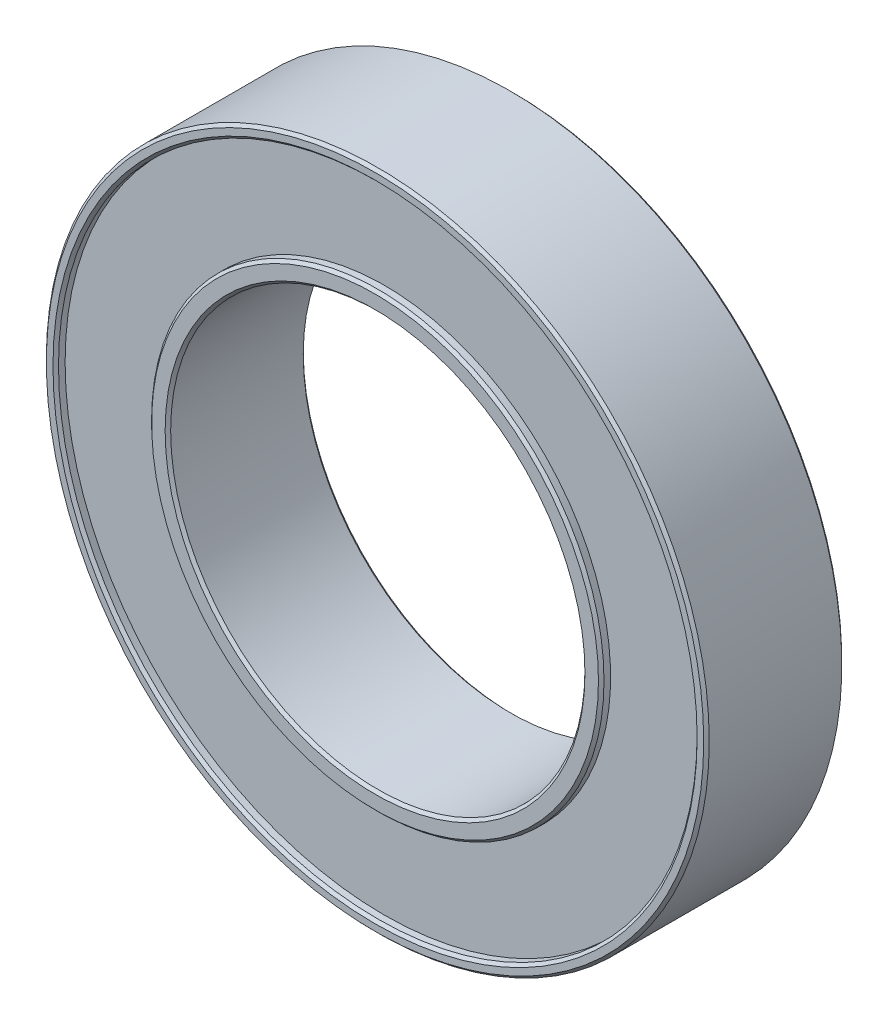
ISO-10303-21;
HEADER;
FILE_DESCRIPTION(('STEP AP214'),'2;1');
FILE_NAME('part.step','',(''),(''),'','','');
FILE_SCHEMA(('AUTOMOTIVE_DESIGN { 1 0 10303 214 1 1 1 1 }'));
ENDSEC;
DATA;
#1=APPLICATION_CONTEXT('core data for automotive mechanical design processes');
#2=APPLICATION_PROTOCOL_DEFINITION('international standard','automotive_design',2000,#1);
#3=PRODUCT_CONTEXT('',#1,'mechanical');
#4=PRODUCT('Part','Part','',(#3));
#5=PRODUCT_RELATED_PRODUCT_CATEGORY('part','',(#4));
#6=PRODUCT_DEFINITION_FORMATION('','',#4);
#7=PRODUCT_DEFINITION_CONTEXT('part definition',#1,'design');
#8=PRODUCT_DEFINITION('design','',#6,#7);
#9=PRODUCT_DEFINITION_SHAPE('','',#8);
#10=(LENGTH_UNIT() NAMED_UNIT(*) SI_UNIT(.MILLI.,.METRE.));
#11=(NAMED_UNIT(*) PLANE_ANGLE_UNIT() SI_UNIT($,.RADIAN.));
#12=(NAMED_UNIT(*) SI_UNIT($,.STERADIAN.) SOLID_ANGLE_UNIT());
#13=UNCERTAINTY_MEASURE_WITH_UNIT(LENGTH_MEASURE(1.E-05),#10,'distance_accuracy_value','');
#14=(GEOMETRIC_REPRESENTATION_CONTEXT(3) GLOBAL_UNCERTAINTY_ASSIGNED_CONTEXT((#13)) GLOBAL_UNIT_ASSIGNED_CONTEXT((#10,
#11,#12)) REPRESENTATION_CONTEXT('',''));
#15=CARTESIAN_POINT('',(0.,0.,0.));
#16=DIRECTION('',(0.,0.,1.));
#17=DIRECTION('',(1.,0.,0.));
#18=AXIS2_PLACEMENT_3D('',#15,#16,#17);
#19=CARTESIAN_POINT('',(0.,8.18943303586407,-2.5));
#20=DIRECTION('',(0.,0.,-1.));
#21=DIRECTION('',(-1.,0.,0.));
#22=AXIS2_PLACEMENT_3D('',#19,#20,#21);
#23=PLANE('',#22);
#24=CARTESIAN_POINT('',(0.,0.,-2.5));
#25=DIRECTION('',(0.,0.,-1.));
#26=DIRECTION('',(-1.,0.,0.));
#27=AXIS2_PLACEMENT_3D('',#24,#25,#26);
#28=CIRCLE('',#27,8.08943303586408);
#29=CARTESIAN_POINT('',(-8.08943303586408,0.,-2.5));
#30=VERTEX_POINT('',#29);
#31=EDGE_CURVE('E74',#30,#30,#28,.T.);
#32=ORIENTED_EDGE('',*,*,#31,.T.);
#33=EDGE_LOOP('',(#32));
#34=FACE_BOUND('',#33,.T.);
#35=CARTESIAN_POINT('',(0.,0.,-2.5));
#36=DIRECTION('',(0.,0.,-1.));
#37=DIRECTION('',(-1.,0.,0.));
#38=AXIS2_PLACEMENT_3D('',#35,#36,#37);
#39=CIRCLE('',#38,7.6);
#40=CARTESIAN_POINT('',(-7.6,0.,-2.5));
#41=VERTEX_POINT('',#40);
#42=EDGE_CURVE('E77',#41,#41,#39,.F.);
#43=ORIENTED_EDGE('',*,*,#42,.T.);
#44=EDGE_LOOP('',(#43));
#45=FACE_BOUND('',#44,.T.);
#46=ADVANCED_FACE('F33',(#34,#45),#23,.T.);
#47=CARTESIAN_POINT('',(0.,0.,-19.0782719959034));
#48=DIRECTION('',(0.,0.,-1.));
#49=DIRECTION('',(-1.,0.,0.));
#50=AXIS2_PLACEMENT_3D('',#47,#48,#49);
#51=CYLINDRICAL_SURFACE('',#50,8.18943303586407);
#52=CARTESIAN_POINT('',(0.,0.,-2.4));
#53=DIRECTION('',(0.,0.,-1.));
#54=DIRECTION('',(-1.,0.,0.));
#55=AXIS2_PLACEMENT_3D('',#52,#53,#54);
#56=CIRCLE('',#55,8.18943303586407);
#57=CARTESIAN_POINT('',(-8.18943303586407,0.,-2.4));
#58=VERTEX_POINT('',#57);
#59=EDGE_CURVE('E71',#58,#58,#56,.F.);
#60=ORIENTED_EDGE('',*,*,#59,.T.);
#61=EDGE_LOOP('',(#60));
#62=FACE_BOUND('',#61,.T.);
#63=CARTESIAN_POINT('',(0.,0.,-2.1603253707757));
#64=DIRECTION('',(0.,0.,-1.));
#65=DIRECTION('',(-1.,0.,0.));
#66=AXIS2_PLACEMENT_3D('',#63,#64,#65);
#67=CIRCLE('',#66,8.18943303586407);
#68=CARTESIAN_POINT('',(-8.18943303586407,0.,-2.1603253707757));
#69=VERTEX_POINT('',#68);
#70=EDGE_CURVE('E89',#69,#69,#67,.T.);
#71=ORIENTED_EDGE('',*,*,#70,.T.);
#72=EDGE_LOOP('',(#71));
#73=FACE_BOUND('',#72,.T.);
#74=ADVANCED_FACE('F120',(#62,#73),#51,.T.);
#75=CARTESIAN_POINT('',(0.,11.56094363004,-2.1603253707757));
#76=DIRECTION('',(0.,0.,-1.));
#77=DIRECTION('',(-1.,0.,0.));
#78=AXIS2_PLACEMENT_3D('',#75,#76,#77);
#79=PLANE('',#78);
#80=CARTESIAN_POINT('',(0.,0.,-2.1603253707757));
#81=DIRECTION('',(0.,0.,-1.));
#82=DIRECTION('',(-1.,0.,0.));
#83=AXIS2_PLACEMENT_3D('',#80,#81,#82);
#84=CIRCLE('',#83,11.56094363004);
#85=CARTESIAN_POINT('',(-11.56094363004,0.,-2.1603253707757));
#86=VERTEX_POINT('',#85);
#87=EDGE_CURVE('E92',#86,#86,#84,.T.);
#88=ORIENTED_EDGE('',*,*,#87,.T.);
#89=EDGE_LOOP('',(#88));
#90=FACE_BOUND('',#89,.T.);
#91=ORIENTED_EDGE('',*,*,#70,.F.);
#92=EDGE_LOOP('',(#91));
#93=FACE_BOUND('',#92,.T.);
#94=ADVANCED_FACE('F126',(#90,#93),#79,.T.);
#95=CARTESIAN_POINT('',(0.,0.,-19.0782719959034));
#96=DIRECTION('',(0.,0.,-1.));
#97=DIRECTION('',(-1.,0.,0.));
#98=AXIS2_PLACEMENT_3D('',#95,#96,#97);
#99=CYLINDRICAL_SURFACE('',#98,11.56094363004);
#100=CARTESIAN_POINT('',(0.,0.,-2.40000000000001));
#101=DIRECTION('',(0.,0.,-1.));
#102=DIRECTION('',(-1.,0.,0.));
#103=AXIS2_PLACEMENT_3D('',#100,#101,#102);
#104=CIRCLE('',#103,11.56094363004);
#105=CARTESIAN_POINT('',(-11.56094363004,0.,-2.40000000000001));
#106=VERTEX_POINT('',#105);
#107=EDGE_CURVE('E86',#106,#106,#104,.T.);
#108=ORIENTED_EDGE('',*,*,#107,.T.);
#109=EDGE_LOOP('',(#108));
#110=FACE_BOUND('',#109,.T.);
#111=ORIENTED_EDGE('',*,*,#87,.F.);
#112=EDGE_LOOP('',(#111));
#113=FACE_BOUND('',#112,.T.);
#114=ADVANCED_FACE('F181',(#110,#113),#99,.F.);
#115=CARTESIAN_POINT('',(0.,12.,-2.5));
#116=DIRECTION('',(0.,0.,-1.));
#117=DIRECTION('',(-1.,0.,0.));
#118=AXIS2_PLACEMENT_3D('',#115,#116,#117);
#119=PLANE('',#118);
#120=CARTESIAN_POINT('',(0.,0.,-2.5));
#121=DIRECTION('',(0.,0.,-1.));
#122=DIRECTION('',(-1.,0.,0.));
#123=AXIS2_PLACEMENT_3D('',#120,#121,#122);
#124=CIRCLE('',#123,11.66094363004);
#125=CARTESIAN_POINT('',(-11.66094363004,0.,-2.5));
#126=VERTEX_POINT('',#125);
#127=EDGE_CURVE('E80',#126,#126,#124,.F.);
#128=ORIENTED_EDGE('',*,*,#127,.T.);
#129=EDGE_LOOP('',(#128));
#130=FACE_BOUND('',#129,.T.);
#131=CARTESIAN_POINT('',(0.,0.,-2.5));
#132=DIRECTION('',(0.,0.,-1.));
#133=DIRECTION('',(-1.,0.,0.));
#134=AXIS2_PLACEMENT_3D('',#131,#132,#133);
#135=CIRCLE('',#134,11.9);
#136=CARTESIAN_POINT('',(-11.9,0.,-2.5));
#137=VERTEX_POINT('',#136);
#138=EDGE_CURVE('E83',#137,#137,#135,.T.);
#139=ORIENTED_EDGE('',*,*,#138,.T.);
#140=EDGE_LOOP('',(#139));
#141=FACE_BOUND('',#140,.T.);
#142=ADVANCED_FACE('F176',(#130,#141),#119,.T.);
#143=CARTESIAN_POINT('',(0.,0.,-19.0782719959034));
#144=DIRECTION('',(0.,0.,-1.));
#145=DIRECTION('',(-1.,0.,0.));
#146=AXIS2_PLACEMENT_3D('',#143,#144,#145);
#147=CYLINDRICAL_SURFACE('',#146,12.);
#148=CARTESIAN_POINT('',(0.,0.,2.40000000000001));
#149=DIRECTION('',(0.,0.,1.));
#150=DIRECTION('',(1.,0.,0.));
#151=AXIS2_PLACEMENT_3D('',#148,#149,#150);
#152=CIRCLE('',#151,12.);
#153=CARTESIAN_POINT('',(12.,0.,2.40000000000001));
#154=VERTEX_POINT('',#153);
#155=EDGE_CURVE('E10',#154,#154,#152,.F.);
#156=ORIENTED_EDGE('',*,*,#155,.T.);
#157=EDGE_LOOP('',(#156));
#158=FACE_BOUND('',#157,.T.);
#159=CARTESIAN_POINT('',(0.,0.,-2.4));
#160=DIRECTION('',(0.,0.,-1.));
#161=DIRECTION('',(-1.,0.,0.));
#162=AXIS2_PLACEMENT_3D('',#159,#160,#161);
#163=CIRCLE('',#162,12.);
#164=CARTESIAN_POINT('',(-12.,0.,-2.4));
#165=VERTEX_POINT('',#164);
#166=EDGE_CURVE('E40',#165,#165,#163,.F.);
#167=ORIENTED_EDGE('',*,*,#166,.T.);
#168=EDGE_LOOP('',(#167));
#169=FACE_BOUND('',#168,.T.);
#170=ADVANCED_FACE('F167',(#158,#169),#147,.T.);
#171=CARTESIAN_POINT('',(0.,12.,2.5));
#172=DIRECTION('',(0.,0.,1.));
#173=DIRECTION('',(1.,0.,0.));
#174=AXIS2_PLACEMENT_3D('',#171,#172,#173);
#175=PLANE('',#174);
#176=CARTESIAN_POINT('',(0.,0.,2.5));
#177=DIRECTION('',(0.,0.,1.));
#178=DIRECTION('',(1.,0.,0.));
#179=AXIS2_PLACEMENT_3D('',#176,#177,#178);
#180=CIRCLE('',#179,11.66094363004);
#181=CARTESIAN_POINT('',(11.66094363004,0.,2.5));
#182=VERTEX_POINT('',#181);
#183=EDGE_CURVE('E65',#182,#182,#180,.F.);
#184=ORIENTED_EDGE('',*,*,#183,.T.);
#185=EDGE_LOOP('',(#184));
#186=FACE_BOUND('',#185,.T.);
#187=CARTESIAN_POINT('',(0.,0.,2.5));
#188=DIRECTION('',(0.,0.,1.));
#189=DIRECTION('',(1.,0.,0.));
#190=AXIS2_PLACEMENT_3D('',#187,#188,#189);
#191=CIRCLE('',#190,11.9);
#192=CARTESIAN_POINT('',(11.9,0.,2.5));
#193=VERTEX_POINT('',#192);
#194=EDGE_CURVE('E68',#193,#193,#191,.T.);
#195=ORIENTED_EDGE('',*,*,#194,.T.);
#196=EDGE_LOOP('',(#195));
#197=FACE_BOUND('',#196,.T.);
#198=ADVANCED_FACE('F165',(#186,#197),#175,.T.);
#199=CARTESIAN_POINT('',(0.,0.,-19.0782719959034));
#200=DIRECTION('',(0.,0.,-1.));
#201=DIRECTION('',(-1.,0.,0.));
#202=AXIS2_PLACEMENT_3D('',#199,#200,#201);
#203=CYLINDRICAL_SURFACE('',#202,11.56094363004);
#204=CARTESIAN_POINT('',(0.,0.,2.40000000000001));
#205=DIRECTION('',(0.,0.,1.));
#206=DIRECTION('',(1.,0.,0.));
#207=AXIS2_PLACEMENT_3D('',#204,#205,#206);
#208=CIRCLE('',#207,11.56094363004);
#209=CARTESIAN_POINT('',(11.56094363004,0.,2.40000000000001));
#210=VERTEX_POINT('',#209);
#211=EDGE_CURVE('E62',#210,#210,#208,.T.);
#212=ORIENTED_EDGE('',*,*,#211,.T.);
#213=EDGE_LOOP('',(#212));
#214=FACE_BOUND('',#213,.T.);
#215=CARTESIAN_POINT('',(0.,0.,2.1603253707757));
#216=DIRECTION('',(0.,0.,-1.));
#217=DIRECTION('',(-1.,0.,0.));
#218=AXIS2_PLACEMENT_3D('',#215,#216,#217);
#219=CIRCLE('',#218,11.56094363004);
#220=CARTESIAN_POINT('',(-11.56094363004,0.,2.1603253707757));
#221=VERTEX_POINT('',#220);
#222=EDGE_CURVE('E95',#221,#221,#219,.T.);
#223=ORIENTED_EDGE('',*,*,#222,.T.);
#224=EDGE_LOOP('',(#223));
#225=FACE_BOUND('',#224,.T.);
#226=ADVANCED_FACE('F117',(#214,#225),#203,.F.);
#227=CARTESIAN_POINT('',(0.,11.56094363004,2.1603253707757));
#228=DIRECTION('',(0.,0.,1.));
#229=DIRECTION('',(1.,0.,0.));
#230=AXIS2_PLACEMENT_3D('',#227,#228,#229);
#231=PLANE('',#230);
#232=CARTESIAN_POINT('',(0.,0.,2.1603253707757));
#233=DIRECTION('',(0.,0.,-1.));
#234=DIRECTION('',(-1.,0.,0.));
#235=AXIS2_PLACEMENT_3D('',#232,#233,#234);
#236=CIRCLE('',#235,8.18943303586407);
#237=CARTESIAN_POINT('',(-8.18943303586407,0.,2.1603253707757));
#238=VERTEX_POINT('',#237);
#239=EDGE_CURVE('E98',#238,#238,#236,.T.);
#240=ORIENTED_EDGE('',*,*,#239,.T.);
#241=EDGE_LOOP('',(#240));
#242=FACE_BOUND('',#241,.T.);
#243=ORIENTED_EDGE('',*,*,#222,.F.);
#244=EDGE_LOOP('',(#243));
#245=FACE_BOUND('',#244,.T.);
#246=ADVANCED_FACE('F102',(#242,#245),#231,.T.);
#247=CARTESIAN_POINT('',(0.,0.,-19.0782719959034));
#248=DIRECTION('',(0.,0.,-1.));
#249=DIRECTION('',(-1.,0.,0.));
#250=AXIS2_PLACEMENT_3D('',#247,#248,#249);
#251=CYLINDRICAL_SURFACE('',#250,8.18943303586407);
#252=CARTESIAN_POINT('',(0.,0.,2.40000000000001));
#253=DIRECTION('',(0.,0.,1.));
#254=DIRECTION('',(1.,0.,0.));
#255=AXIS2_PLACEMENT_3D('',#252,#253,#254);
#256=CIRCLE('',#255,8.18943303586407);
#257=CARTESIAN_POINT('',(8.18943303586407,0.,2.40000000000001));
#258=VERTEX_POINT('',#257);
#259=EDGE_CURVE('E59',#258,#258,#256,.F.);
#260=ORIENTED_EDGE('',*,*,#259,.T.);
#261=EDGE_LOOP('',(#260));
#262=FACE_BOUND('',#261,.T.);
#263=ORIENTED_EDGE('',*,*,#239,.F.);
#264=EDGE_LOOP('',(#263));
#265=FACE_BOUND('',#264,.T.);
#266=ADVANCED_FACE('F105',(#262,#265),#251,.T.);
#267=CARTESIAN_POINT('',(0.,8.18943303586407,2.5));
#268=DIRECTION('',(0.,0.,1.));
#269=DIRECTION('',(1.,0.,0.));
#270=AXIS2_PLACEMENT_3D('',#267,#268,#269);
#271=PLANE('',#270);
#272=CARTESIAN_POINT('',(0.,0.,2.5));
#273=DIRECTION('',(0.,0.,1.));
#274=DIRECTION('',(1.,0.,0.));
#275=AXIS2_PLACEMENT_3D('',#272,#273,#274);
#276=CIRCLE('',#275,8.08943303586409);
#277=CARTESIAN_POINT('',(8.08943303586409,0.,2.5));
#278=VERTEX_POINT('',#277);
#279=EDGE_CURVE('E53',#278,#278,#276,.T.);
#280=ORIENTED_EDGE('',*,*,#279,.T.);
#281=EDGE_LOOP('',(#280));
#282=FACE_BOUND('',#281,.T.);
#283=CARTESIAN_POINT('',(0.,0.,2.5));
#284=DIRECTION('',(0.,0.,1.));
#285=DIRECTION('',(1.,0.,0.));
#286=AXIS2_PLACEMENT_3D('',#283,#284,#285);
#287=CIRCLE('',#286,7.59999999999999);
#288=CARTESIAN_POINT('',(7.59999999999999,0.,2.5));
#289=VERTEX_POINT('',#288);
#290=EDGE_CURVE('E56',#289,#289,#287,.F.);
#291=ORIENTED_EDGE('',*,*,#290,.T.);
#292=EDGE_LOOP('',(#291));
#293=FACE_BOUND('',#292,.T.);
#294=ADVANCED_FACE('F107',(#282,#293),#271,.T.);
#295=CARTESIAN_POINT('',(0.,0.,-19.0782719959034));
#296=DIRECTION('',(0.,0.,-1.));
#297=DIRECTION('',(-1.,0.,0.));
#298=AXIS2_PLACEMENT_3D('',#295,#296,#297);
#299=CYLINDRICAL_SURFACE('',#298,7.5);
#300=CARTESIAN_POINT('',(0.,0.,-2.4));
#301=DIRECTION('',(0.,0.,-1.));
#302=DIRECTION('',(-1.,0.,0.));
#303=AXIS2_PLACEMENT_3D('',#300,#301,#302);
#304=CIRCLE('',#303,7.5);
#305=CARTESIAN_POINT('',(-7.5,0.,-2.4));
#306=VERTEX_POINT('',#305);
#307=EDGE_CURVE('E44',#306,#306,#304,.T.);
#308=ORIENTED_EDGE('',*,*,#307,.T.);
#309=EDGE_LOOP('',(#308));
#310=FACE_BOUND('',#309,.T.);
#311=CARTESIAN_POINT('',(0.,0.,2.40000000000001));
#312=DIRECTION('',(0.,0.,1.));
#313=DIRECTION('',(1.,0.,0.));
#314=AXIS2_PLACEMENT_3D('',#311,#312,#313);
#315=CIRCLE('',#314,7.5);
#316=CARTESIAN_POINT('',(7.5,0.,2.40000000000001));
#317=VERTEX_POINT('',#316);
#318=EDGE_CURVE('E48',#317,#317,#315,.T.);
#319=ORIENTED_EDGE('',*,*,#318,.T.);
#320=EDGE_LOOP('',(#319));
#321=FACE_BOUND('',#320,.T.);
#322=ADVANCED_FACE('F114',(#310,#321),#299,.F.);
#323=CARTESIAN_POINT('',(0.,0.,-2.40000000000001));
#324=DIRECTION('',(0.,0.,-1.));
#325=DIRECTION('',(-1.,0.,0.));
#326=AXIS2_PLACEMENT_3D('',#323,#324,#325);
#327=CONICAL_SURFACE('',#326,11.56094363004,0.785398163397457);
#328=ORIENTED_EDGE('',*,*,#127,.F.);
#329=EDGE_LOOP('',(#328));
#330=FACE_BOUND('',#329,.T.);
#331=ORIENTED_EDGE('',*,*,#107,.F.);
#332=EDGE_LOOP('',(#331));
#333=FACE_BOUND('',#332,.T.);
#334=ADVANCED_FACE('F132',(#330,#333),#327,.F.);
#335=CARTESIAN_POINT('',(0.,0.,-2.5));
#336=DIRECTION('',(0.,0.,1.));
#337=DIRECTION('',(1.,0.,0.));
#338=AXIS2_PLACEMENT_3D('',#335,#336,#337);
#339=CONICAL_SURFACE('',#338,8.08943303586408,0.78539816339744);
#340=ORIENTED_EDGE('',*,*,#59,.F.);
#341=EDGE_LOOP('',(#340));
#342=FACE_BOUND('',#341,.T.);
#343=ORIENTED_EDGE('',*,*,#31,.F.);
#344=EDGE_LOOP('',(#343));
#345=FACE_BOUND('',#344,.T.);
#346=ADVANCED_FACE('F135',(#342,#345),#339,.T.);
#347=CARTESIAN_POINT('',(0.,0.,2.5));
#348=DIRECTION('',(0.,0.,1.));
#349=DIRECTION('',(1.,0.,0.));
#350=AXIS2_PLACEMENT_3D('',#347,#348,#349);
#351=CONICAL_SURFACE('',#350,11.66094363004,0.785398163397448);
#352=ORIENTED_EDGE('',*,*,#211,.F.);
#353=EDGE_LOOP('',(#352));
#354=FACE_BOUND('',#353,.T.);
#355=ORIENTED_EDGE('',*,*,#183,.F.);
#356=EDGE_LOOP('',(#355));
#357=FACE_BOUND('',#356,.T.);
#358=ADVANCED_FACE('F139',(#354,#357),#351,.F.);
#359=CARTESIAN_POINT('',(0.,0.,2.40000000000001));
#360=DIRECTION('',(0.,0.,-1.));
#361=DIRECTION('',(-1.,0.,0.));
#362=AXIS2_PLACEMENT_3D('',#359,#360,#361);
#363=CONICAL_SURFACE('',#362,8.18943303586407,0.785398163397405);
#364=ORIENTED_EDGE('',*,*,#279,.F.);
#365=EDGE_LOOP('',(#364));
#366=FACE_BOUND('',#365,.T.);
#367=ORIENTED_EDGE('',*,*,#259,.F.);
#368=EDGE_LOOP('',(#367));
#369=FACE_BOUND('',#368,.T.);
#370=ADVANCED_FACE('F143',(#366,#369),#363,.T.);
#371=CARTESIAN_POINT('',(0.,0.,-2.4));
#372=DIRECTION('',(0.,0.,-1.));
#373=DIRECTION('',(-1.,0.,0.));
#374=AXIS2_PLACEMENT_3D('',#371,#372,#373);
#375=CONICAL_SURFACE('',#374,7.5,0.785398163397453);
#376=ORIENTED_EDGE('',*,*,#42,.F.);
#377=EDGE_LOOP('',(#376));
#378=FACE_BOUND('',#377,.T.);
#379=ORIENTED_EDGE('',*,*,#307,.F.);
#380=EDGE_LOOP('',(#379));
#381=FACE_BOUND('',#380,.T.);
#382=ADVANCED_FACE('F147',(#378,#381),#375,.F.);
#383=CARTESIAN_POINT('',(0.,0.,2.5));
#384=DIRECTION('',(0.,0.,1.));
#385=DIRECTION('',(1.,0.,0.));
#386=AXIS2_PLACEMENT_3D('',#383,#384,#385);
#387=CONICAL_SURFACE('',#386,7.6,0.785398163397448);
#388=ORIENTED_EDGE('',*,*,#318,.F.);
#389=EDGE_LOOP('',(#388));
#390=FACE_BOUND('',#389,.T.);
#391=ORIENTED_EDGE('',*,*,#290,.F.);
#392=EDGE_LOOP('',(#391));
#393=FACE_BOUND('',#392,.T.);
#394=ADVANCED_FACE('F151',(#390,#393),#387,.F.);
#395=CARTESIAN_POINT('',(0.,0.,2.40000000000001));
#396=DIRECTION('',(0.,0.,-1.));
#397=DIRECTION('',(-1.,0.,0.));
#398=AXIS2_PLACEMENT_3D('',#395,#396,#397);
#399=CONICAL_SURFACE('',#398,12.,0.785398163397457);
#400=ORIENTED_EDGE('',*,*,#194,.F.);
#401=EDGE_LOOP('',(#400));
#402=FACE_BOUND('',#401,.T.);
#403=ORIENTED_EDGE('',*,*,#155,.F.);
#404=EDGE_LOOP('',(#403));
#405=FACE_BOUND('',#404,.T.);
#406=ADVANCED_FACE('F154',(#402,#405),#399,.T.);
#407=CARTESIAN_POINT('',(0.,0.,-2.5));
#408=DIRECTION('',(0.,0.,1.));
#409=DIRECTION('',(1.,0.,0.));
#410=AXIS2_PLACEMENT_3D('',#407,#408,#409);
#411=CONICAL_SURFACE('',#410,11.9,0.785398163397448);
#412=ORIENTED_EDGE('',*,*,#166,.F.);
#413=EDGE_LOOP('',(#412));
#414=FACE_BOUND('',#413,.T.);
#415=ORIENTED_EDGE('',*,*,#138,.F.);
#416=EDGE_LOOP('',(#415));
#417=FACE_BOUND('',#416,.T.);
#418=ADVANCED_FACE('F35',(#414,#417),#411,.T.);
#419=CLOSED_SHELL('',(#46,#74,#94,#114,#142,#170,#198,#226,#246,#266,#294,#322,#334,#346,#358,
#370,#382,#394,#406,#418));
#420=MANIFOLD_SOLID_BREP('B2',#419);
#421=ADVANCED_BREP_SHAPE_REPRESENTATION('',(#18,#420),#14);
#422=SHAPE_DEFINITION_REPRESENTATION(#9,#421);
ENDSEC;
END-ISO-10303-21;
